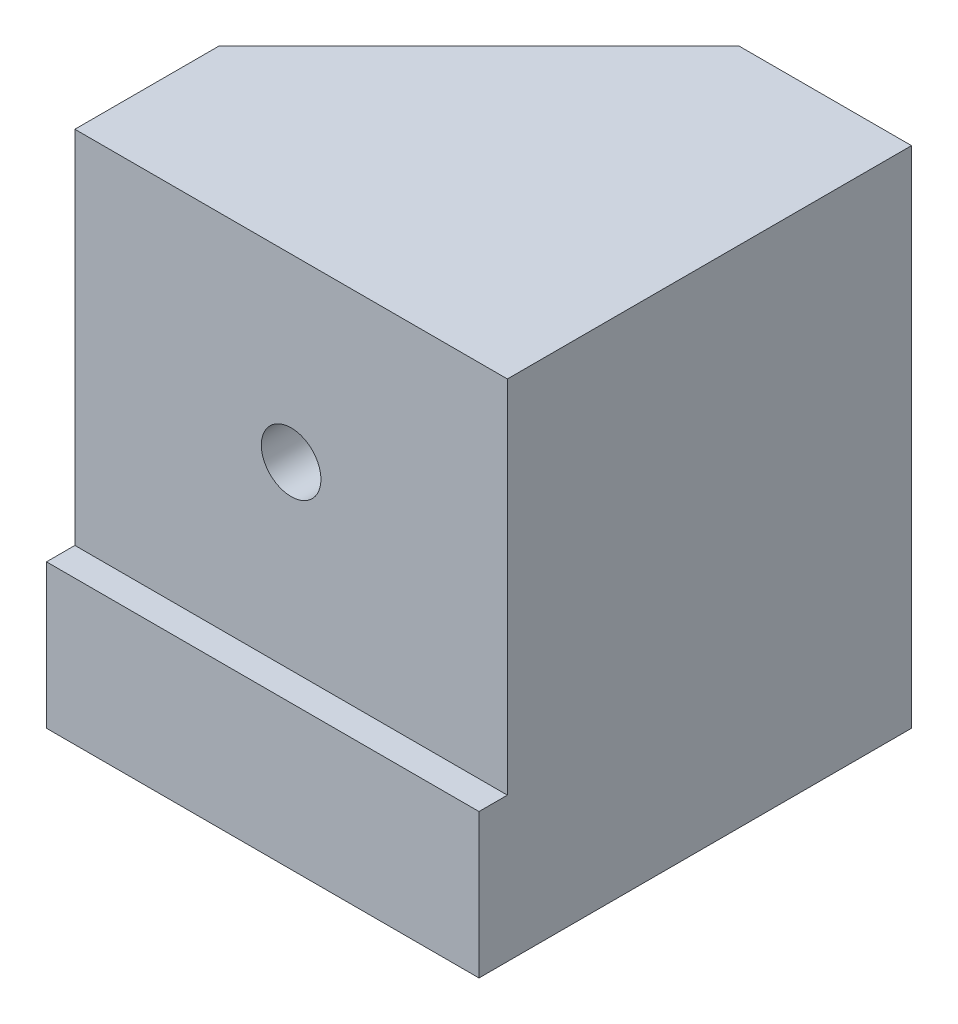
ISO-10303-21;
HEADER;
FILE_DESCRIPTION(('STEP AP214'),'2;1');
FILE_NAME('part.step','',(''),(''),'','','');
FILE_SCHEMA(('AUTOMOTIVE_DESIGN { 1 0 10303 214 1 1 1 1 }'));
ENDSEC;
DATA;
#1=APPLICATION_CONTEXT('core data for automotive mechanical design processes');
#2=APPLICATION_PROTOCOL_DEFINITION('international standard','automotive_design',2000,#1);
#3=PRODUCT_CONTEXT('',#1,'mechanical');
#4=PRODUCT('Part','Part','',(#3));
#5=PRODUCT_RELATED_PRODUCT_CATEGORY('part','',(#4));
#6=PRODUCT_DEFINITION_FORMATION('','',#4);
#7=PRODUCT_DEFINITION_CONTEXT('part definition',#1,'design');
#8=PRODUCT_DEFINITION('design','',#6,#7);
#9=PRODUCT_DEFINITION_SHAPE('','',#8);
#10=(LENGTH_UNIT() NAMED_UNIT(*) SI_UNIT(.MILLI.,.METRE.));
#11=(NAMED_UNIT(*) PLANE_ANGLE_UNIT() SI_UNIT($,.RADIAN.));
#12=(NAMED_UNIT(*) SI_UNIT($,.STERADIAN.) SOLID_ANGLE_UNIT());
#13=UNCERTAINTY_MEASURE_WITH_UNIT(LENGTH_MEASURE(1.E-05),#10,'distance_accuracy_value','');
#14=(GEOMETRIC_REPRESENTATION_CONTEXT(3) GLOBAL_UNCERTAINTY_ASSIGNED_CONTEXT((#13)) GLOBAL_UNIT_ASSIGNED_CONTEXT((#10,
#11,#12)) REPRESENTATION_CONTEXT('',''));
#15=CARTESIAN_POINT('',(0.,0.,0.));
#16=DIRECTION('',(0.,0.,1.));
#17=DIRECTION('',(1.,0.,0.));
#18=AXIS2_PLACEMENT_3D('',#15,#16,#17);
#19=CARTESIAN_POINT('',(0.,88.9,-76.2));
#20=DIRECTION('',(0.,-1.,0.));
#21=DIRECTION('',(0.,0.,-1.));
#22=AXIS2_PLACEMENT_3D('',#19,#20,#21);
#23=PLANE('',#22);
#24=DIRECTION('',(-1.,0.,0.));
#25=VECTOR('',#24,1.);
#26=CARTESIAN_POINT('',(0.,88.9,-76.2));
#27=LINE('',#26,#25);
#28=CARTESIAN_POINT('',(76.2,88.9,-76.2));
#29=VERTEX_POINT('',#28);
#30=CARTESIAN_POINT('',(45.8,88.9,-76.2));
#31=VERTEX_POINT('',#30);
#32=EDGE_CURVE('E120',#29,#31,#27,.T.);
#33=ORIENTED_EDGE('',*,*,#32,.T.);
#34=DIRECTION('',(0.707106781186548,0.,-0.707106781186548));
#35=VECTOR('',#34,1.);
#36=CARTESIAN_POINT('',(-16.479024868923,88.9,-13.920975131077));
#37=LINE('',#36,#35);
#38=CARTESIAN_POINT('',(0.,88.9,-30.4));
#39=VERTEX_POINT('',#38);
#40=EDGE_CURVE('E100',#39,#31,#37,.T.);
#41=ORIENTED_EDGE('',*,*,#40,.F.);
#42=DIRECTION('',(0.,0.,1.));
#43=VECTOR('',#42,1.);
#44=CARTESIAN_POINT('',(0.,88.9,0.));
#45=LINE('',#44,#43);
#46=CARTESIAN_POINT('',(0.,88.9,-5.));
#47=VERTEX_POINT('',#46);
#48=EDGE_CURVE('E107',#39,#47,#45,.T.);
#49=ORIENTED_EDGE('',*,*,#48,.T.);
#50=DIRECTION('',(-1.,0.,0.));
#51=VECTOR('',#50,1.);
#52=CARTESIAN_POINT('',(0.,88.9,-5.));
#53=LINE('',#52,#51);
#54=CARTESIAN_POINT('',(76.2,88.9,-5.));
#55=VERTEX_POINT('',#54);
#56=EDGE_CURVE('E148',#55,#47,#53,.T.);
#57=ORIENTED_EDGE('',*,*,#56,.F.);
#58=DIRECTION('',(0.,0.,-1.));
#59=VECTOR('',#58,1.);
#60=CARTESIAN_POINT('',(76.2,88.9,0.));
#61=LINE('',#60,#59);
#62=EDGE_CURVE('E142',#55,#29,#61,.T.);
#63=ORIENTED_EDGE('',*,*,#62,.T.);
#64=EDGE_LOOP('',(#33,#41,#49,#57,#63));
#65=FACE_BOUND('',#64,.T.);
#66=ADVANCED_FACE('F31',(#65),#23,.F.);
#67=CARTESIAN_POINT('',(38.1,57.15,-300.));
#68=DIRECTION('',(0.,0.,1.));
#69=DIRECTION('',(1.,0.,0.));
#70=AXIS2_PLACEMENT_3D('',#67,#68,#69);
#71=CYLINDRICAL_SURFACE('',#70,5.25);
#72=CARTESIAN_POINT('',(38.1,57.15,-68.4999999999999));
#73=DIRECTION('',(0.707106781186547,0.,0.707106781186547));
#74=DIRECTION('',(-0.707106781186548,0.,0.707106781186548));
#75=AXIS2_PLACEMENT_3D('',#72,#73,#74);
#76=ELLIPSE('',#75,7.42462120245874,5.25);
#77=CARTESIAN_POINT('',(32.85,57.15,-63.25));
#78=VERTEX_POINT('',#77);
#79=EDGE_CURVE('E153',#78,#78,#76,.F.);
#80=ORIENTED_EDGE('',*,*,#79,.T.);
#81=EDGE_LOOP('',(#80));
#82=FACE_BOUND('',#81,.T.);
#83=CARTESIAN_POINT('',(38.1,57.15,-5.));
#84=DIRECTION('',(0.,0.,1.));
#85=DIRECTION('',(1.,0.,0.));
#86=AXIS2_PLACEMENT_3D('',#83,#84,#85);
#87=CIRCLE('',#86,5.25);
#88=CARTESIAN_POINT('',(43.35,57.15,-5.));
#89=VERTEX_POINT('',#88);
#90=EDGE_CURVE('E35',#89,#89,#87,.F.);
#91=ORIENTED_EDGE('',*,*,#90,.F.);
#92=EDGE_LOOP('',(#91));
#93=FACE_BOUND('',#92,.T.);
#94=ADVANCED_FACE('F178',(#82,#93),#71,.F.);
#95=CARTESIAN_POINT('',(0.,88.9,0.));
#96=DIRECTION('',(1.,0.,0.));
#97=DIRECTION('',(0.,0.,-1.));
#98=AXIS2_PLACEMENT_3D('',#95,#96,#97);
#99=PLANE('',#98);
#100=ORIENTED_EDGE('',*,*,#48,.F.);
#101=DIRECTION('',(0.,1.,0.));
#102=VECTOR('',#101,1.);
#103=CARTESIAN_POINT('',(0.,0.,-30.4));
#104=LINE('',#103,#102);
#105=CARTESIAN_POINT('',(0.,0.,-30.4));
#106=VERTEX_POINT('',#105);
#107=EDGE_CURVE('E94',#106,#39,#104,.T.);
#108=ORIENTED_EDGE('',*,*,#107,.F.);
#109=DIRECTION('',(0.,0.,1.));
#110=VECTOR('',#109,1.);
#111=CARTESIAN_POINT('',(0.,0.,0.));
#112=LINE('',#111,#110);
#113=CARTESIAN_POINT('',(0.,0.,0.));
#114=VERTEX_POINT('',#113);
#115=EDGE_CURVE('E105',#106,#114,#112,.T.);
#116=ORIENTED_EDGE('',*,*,#115,.T.);
#117=DIRECTION('',(0.,-1.,0.));
#118=VECTOR('',#117,1.);
#119=CARTESIAN_POINT('',(0.,88.9,0.));
#120=LINE('',#119,#118);
#121=CARTESIAN_POINT('',(0.,25.4,0.));
#122=VERTEX_POINT('',#121);
#123=EDGE_CURVE('E11',#122,#114,#120,.T.);
#124=ORIENTED_EDGE('',*,*,#123,.F.);
#125=DIRECTION('',(0.,0.,1.));
#126=VECTOR('',#125,1.);
#127=CARTESIAN_POINT('',(0.,25.4,-5.));
#128=LINE('',#127,#126);
#129=CARTESIAN_POINT('',(0.,25.4,-5.));
#130=VERTEX_POINT('',#129);
#131=EDGE_CURVE('E146',#130,#122,#128,.T.);
#132=ORIENTED_EDGE('',*,*,#131,.F.);
#133=DIRECTION('',(0.,-1.,0.));
#134=VECTOR('',#133,1.);
#135=CARTESIAN_POINT('',(0.,88.9,-5.));
#136=LINE('',#135,#134);
#137=EDGE_CURVE('E152',#47,#130,#136,.T.);
#138=ORIENTED_EDGE('',*,*,#137,.F.);
#139=EDGE_LOOP('',(#100,#108,#116,#124,#132,#138));
#140=FACE_BOUND('',#139,.T.);
#141=ADVANCED_FACE('F33',(#140),#99,.F.);
#142=CARTESIAN_POINT('',(0.,88.9,0.));
#143=DIRECTION('',(0.,0.,-1.));
#144=DIRECTION('',(-1.,0.,0.));
#145=AXIS2_PLACEMENT_3D('',#142,#143,#144);
#146=PLANE('',#145);
#147=DIRECTION('',(0.,-1.,0.));
#148=VECTOR('',#147,1.);
#149=CARTESIAN_POINT('',(76.2,88.9,0.));
#150=LINE('',#149,#148);
#151=CARTESIAN_POINT('',(76.2,25.4,0.));
#152=VERTEX_POINT('',#151);
#153=CARTESIAN_POINT('',(76.2,0.,0.));
#154=VERTEX_POINT('',#153);
#155=EDGE_CURVE('E40',#152,#154,#150,.T.);
#156=ORIENTED_EDGE('',*,*,#155,.F.);
#157=DIRECTION('',(1.,0.,0.));
#158=VECTOR('',#157,1.);
#159=CARTESIAN_POINT('',(0.,25.4,0.));
#160=LINE('',#159,#158);
#161=EDGE_CURVE('E150',#122,#152,#160,.T.);
#162=ORIENTED_EDGE('',*,*,#161,.F.);
#163=ORIENTED_EDGE('',*,*,#123,.T.);
#164=DIRECTION('',(1.,0.,0.));
#165=VECTOR('',#164,1.);
#166=CARTESIAN_POINT('',(0.,0.,0.));
#167=LINE('',#166,#165);
#168=EDGE_CURVE('E113',#114,#154,#167,.T.);
#169=ORIENTED_EDGE('',*,*,#168,.T.);
#170=EDGE_LOOP('',(#156,#162,#163,#169));
#171=FACE_BOUND('',#170,.T.);
#172=ADVANCED_FACE('F136',(#171),#146,.F.);
#173=CARTESIAN_POINT('',(76.2,88.9,0.));
#174=DIRECTION('',(-1.,0.,0.));
#175=DIRECTION('',(0.,0.,1.));
#176=AXIS2_PLACEMENT_3D('',#173,#174,#175);
#177=PLANE('',#176);
#178=DIRECTION('',(0.,1.,0.));
#179=VECTOR('',#178,1.);
#180=CARTESIAN_POINT('',(76.2,88.9,-5.));
#181=LINE('',#180,#179);
#182=CARTESIAN_POINT('',(76.2,25.4,-5.));
#183=VERTEX_POINT('',#182);
#184=EDGE_CURVE('E55',#183,#55,#181,.T.);
#185=ORIENTED_EDGE('',*,*,#184,.F.);
#186=DIRECTION('',(0.,0.,1.));
#187=VECTOR('',#186,1.);
#188=CARTESIAN_POINT('',(76.2,25.4,-5.));
#189=LINE('',#188,#187);
#190=EDGE_CURVE('E118',#183,#152,#189,.T.);
#191=ORIENTED_EDGE('',*,*,#190,.T.);
#192=ORIENTED_EDGE('',*,*,#155,.T.);
#193=DIRECTION('',(0.,0.,-1.));
#194=VECTOR('',#193,1.);
#195=CARTESIAN_POINT('',(76.2,0.,0.));
#196=LINE('',#195,#194);
#197=CARTESIAN_POINT('',(76.2,0.,-76.2));
#198=VERTEX_POINT('',#197);
#199=EDGE_CURVE('E115',#154,#198,#196,.T.);
#200=ORIENTED_EDGE('',*,*,#199,.T.);
#201=DIRECTION('',(0.,-1.,0.));
#202=VECTOR('',#201,1.);
#203=CARTESIAN_POINT('',(76.2,88.9,-76.2));
#204=LINE('',#203,#202);
#205=EDGE_CURVE('E126',#29,#198,#204,.T.);
#206=ORIENTED_EDGE('',*,*,#205,.F.);
#207=ORIENTED_EDGE('',*,*,#62,.F.);
#208=EDGE_LOOP('',(#185,#191,#192,#200,#206,#207));
#209=FACE_BOUND('',#208,.T.);
#210=ADVANCED_FACE('F132',(#209),#177,.F.);
#211=CARTESIAN_POINT('',(0.,88.9,-76.2));
#212=DIRECTION('',(0.,0.,1.));
#213=DIRECTION('',(1.,0.,0.));
#214=AXIS2_PLACEMENT_3D('',#211,#212,#213);
#215=PLANE('',#214);
#216=DIRECTION('',(-1.,0.,0.));
#217=VECTOR('',#216,1.);
#218=CARTESIAN_POINT('',(0.,0.,-76.2));
#219=LINE('',#218,#217);
#220=CARTESIAN_POINT('',(45.8,0.,-76.2));
#221=VERTEX_POINT('',#220);
#222=EDGE_CURVE('E124',#198,#221,#219,.T.);
#223=ORIENTED_EDGE('',*,*,#222,.T.);
#224=DIRECTION('',(0.,1.,0.));
#225=VECTOR('',#224,1.);
#226=CARTESIAN_POINT('',(45.8,0.,-76.2));
#227=LINE('',#226,#225);
#228=EDGE_CURVE('E47',#221,#31,#227,.T.);
#229=ORIENTED_EDGE('',*,*,#228,.T.);
#230=ORIENTED_EDGE('',*,*,#32,.F.);
#231=ORIENTED_EDGE('',*,*,#205,.T.);
#232=EDGE_LOOP('',(#223,#229,#230,#231));
#233=FACE_BOUND('',#232,.T.);
#234=ADVANCED_FACE('F138',(#233),#215,.F.);
#235=CARTESIAN_POINT('',(0.,0.,-76.2));
#236=DIRECTION('',(0.,-1.,0.));
#237=DIRECTION('',(0.,0.,-1.));
#238=AXIS2_PLACEMENT_3D('',#235,#236,#237);
#239=PLANE('',#238);
#240=DIRECTION('',(0.707106781186548,0.,-0.707106781186548));
#241=VECTOR('',#240,1.);
#242=CARTESIAN_POINT('',(-16.479024868923,0.,-13.920975131077));
#243=LINE('',#242,#241);
#244=EDGE_CURVE('E90',#106,#221,#243,.T.);
#245=ORIENTED_EDGE('',*,*,#244,.T.);
#246=ORIENTED_EDGE('',*,*,#222,.F.);
#247=ORIENTED_EDGE('',*,*,#199,.F.);
#248=ORIENTED_EDGE('',*,*,#168,.F.);
#249=ORIENTED_EDGE('',*,*,#115,.F.);
#250=EDGE_LOOP('',(#245,#246,#247,#248,#249));
#251=FACE_BOUND('',#250,.T.);
#252=ADVANCED_FACE('F110',(#251),#239,.T.);
#253=CARTESIAN_POINT('',(0.,25.4,-5.));
#254=DIRECTION('',(0.,0.,1.));
#255=DIRECTION('',(1.,0.,0.));
#256=AXIS2_PLACEMENT_3D('',#253,#254,#255);
#257=PLANE('',#256);
#258=ORIENTED_EDGE('',*,*,#137,.T.);
#259=DIRECTION('',(1.,0.,0.));
#260=VECTOR('',#259,1.);
#261=CARTESIAN_POINT('',(0.,25.4,-5.));
#262=LINE('',#261,#260);
#263=EDGE_CURVE('E156',#130,#183,#262,.T.);
#264=ORIENTED_EDGE('',*,*,#263,.T.);
#265=ORIENTED_EDGE('',*,*,#184,.T.);
#266=ORIENTED_EDGE('',*,*,#56,.T.);
#267=EDGE_LOOP('',(#258,#264,#265,#266));
#268=FACE_BOUND('',#267,.T.);
#269=ORIENTED_EDGE('',*,*,#90,.T.);
#270=EDGE_LOOP('',(#269));
#271=FACE_BOUND('',#270,.T.);
#272=ADVANCED_FACE('F163',(#268,#271),#257,.T.);
#273=CARTESIAN_POINT('',(0.,25.4,-5.));
#274=DIRECTION('',(0.,-1.,0.));
#275=DIRECTION('',(0.,0.,-1.));
#276=AXIS2_PLACEMENT_3D('',#273,#274,#275);
#277=PLANE('',#276);
#278=ORIENTED_EDGE('',*,*,#161,.T.);
#279=ORIENTED_EDGE('',*,*,#190,.F.);
#280=ORIENTED_EDGE('',*,*,#263,.F.);
#281=ORIENTED_EDGE('',*,*,#131,.T.);
#282=EDGE_LOOP('',(#278,#279,#280,#281));
#283=FACE_BOUND('',#282,.T.);
#284=ADVANCED_FACE('F167',(#283),#277,.F.);
#285=CARTESIAN_POINT('',(-16.479024868923,0.,-13.920975131077));
#286=DIRECTION('',(0.707106781186547,0.,0.707106781186547));
#287=DIRECTION('',(0.707106781186548,0.,-0.707106781186548));
#288=AXIS2_PLACEMENT_3D('',#285,#286,#287);
#289=PLANE('',#288);
#290=ORIENTED_EDGE('',*,*,#40,.T.);
#291=ORIENTED_EDGE('',*,*,#228,.F.);
#292=ORIENTED_EDGE('',*,*,#244,.F.);
#293=ORIENTED_EDGE('',*,*,#107,.T.);
#294=EDGE_LOOP('',(#290,#291,#292,#293));
#295=FACE_BOUND('',#294,.T.);
#296=ORIENTED_EDGE('',*,*,#79,.F.);
#297=EDGE_LOOP('',(#296));
#298=FACE_BOUND('',#297,.T.);
#299=ADVANCED_FACE('F92',(#295,#298),#289,.F.);
#300=CLOSED_SHELL('',(#66,#94,#141,#172,#210,#234,#252,#272,#284,#299));
#301=MANIFOLD_SOLID_BREP('B2',#300);
#302=ADVANCED_BREP_SHAPE_REPRESENTATION('',(#18,#301),#14);
#303=SHAPE_DEFINITION_REPRESENTATION(#9,#302);
ENDSEC;
END-ISO-10303-21;
